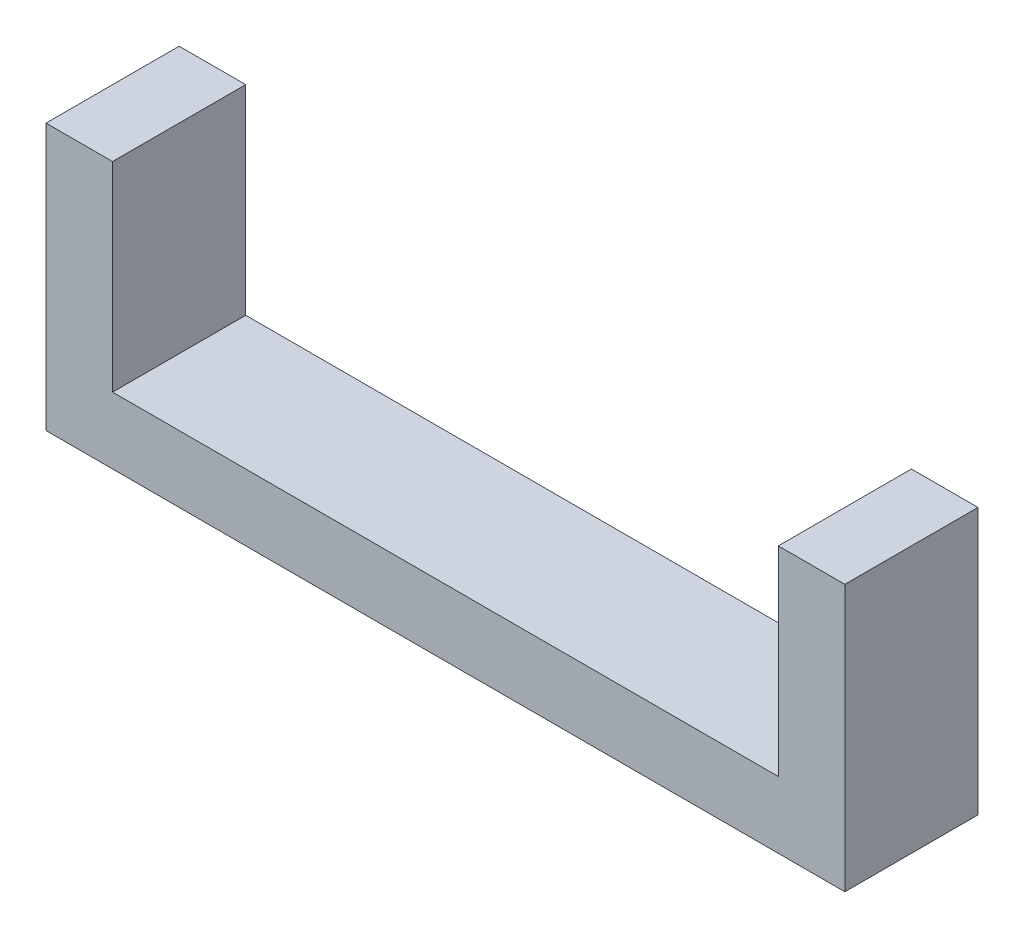
ISO-10303-21;
HEADER;
FILE_DESCRIPTION(('STEP AP214'),'2;1');
FILE_NAME('part.step','',(''),(''),'','','');
FILE_SCHEMA(('AUTOMOTIVE_DESIGN { 1 0 10303 214 1 1 1 1 }'));
ENDSEC;
DATA;
#1=APPLICATION_CONTEXT('core data for automotive mechanical design processes');
#2=APPLICATION_PROTOCOL_DEFINITION('international standard','automotive_design',2000,#1);
#3=PRODUCT_CONTEXT('',#1,'mechanical');
#4=PRODUCT('Part','Part','',(#3));
#5=PRODUCT_RELATED_PRODUCT_CATEGORY('part','',(#4));
#6=PRODUCT_DEFINITION_FORMATION('','',#4);
#7=PRODUCT_DEFINITION_CONTEXT('part definition',#1,'design');
#8=PRODUCT_DEFINITION('design','',#6,#7);
#9=PRODUCT_DEFINITION_SHAPE('','',#8);
#10=(LENGTH_UNIT() NAMED_UNIT(*) SI_UNIT(.MILLI.,.METRE.));
#11=(NAMED_UNIT(*) PLANE_ANGLE_UNIT() SI_UNIT($,.RADIAN.));
#12=(NAMED_UNIT(*) SI_UNIT($,.STERADIAN.) SOLID_ANGLE_UNIT());
#13=UNCERTAINTY_MEASURE_WITH_UNIT(LENGTH_MEASURE(1.E-05),#10,'distance_accuracy_value','');
#14=(GEOMETRIC_REPRESENTATION_CONTEXT(3) GLOBAL_UNCERTAINTY_ASSIGNED_CONTEXT((#13)) GLOBAL_UNIT_ASSIGNED_CONTEXT((#10,
#11,#12)) REPRESENTATION_CONTEXT('',''));
#15=CARTESIAN_POINT('',(0.,0.,0.));
#16=DIRECTION('',(0.,0.,1.));
#17=DIRECTION('',(1.,0.,0.));
#18=AXIS2_PLACEMENT_3D('',#15,#16,#17);
#19=CARTESIAN_POINT('',(-38.1,25.4,12.7));
#20=DIRECTION('',(1.,0.,0.));
#21=DIRECTION('',(0.,1.,0.));
#22=AXIS2_PLACEMENT_3D('',#19,#20,#21);
#23=PLANE('',#22);
#24=DIRECTION('',(0.,-1.,0.));
#25=VECTOR('',#24,1.);
#26=CARTESIAN_POINT('',(-38.1,25.4,0.));
#27=LINE('',#26,#25);
#28=CARTESIAN_POINT('',(-38.1,25.4,0.));
#29=VERTEX_POINT('',#28);
#30=CARTESIAN_POINT('',(-38.1,0.,0.));
#31=VERTEX_POINT('',#30);
#32=EDGE_CURVE('E128',#29,#31,#27,.T.);
#33=ORIENTED_EDGE('',*,*,#32,.T.);
#34=DIRECTION('',(0.,0.,-1.));
#35=VECTOR('',#34,1.);
#36=CARTESIAN_POINT('',(-38.1,0.,12.7));
#37=LINE('',#36,#35);
#38=CARTESIAN_POINT('',(-38.1,0.,12.7));
#39=VERTEX_POINT('',#38);
#40=EDGE_CURVE('E11',#39,#31,#37,.T.);
#41=ORIENTED_EDGE('',*,*,#40,.F.);
#42=DIRECTION('',(0.,-1.,0.));
#43=VECTOR('',#42,1.);
#44=CARTESIAN_POINT('',(-38.1,25.4,12.7));
#45=LINE('',#44,#43);
#46=CARTESIAN_POINT('',(-38.1,25.4,12.7));
#47=VERTEX_POINT('',#46);
#48=EDGE_CURVE('E142',#47,#39,#45,.T.);
#49=ORIENTED_EDGE('',*,*,#48,.F.);
#50=DIRECTION('',(0.,0.,-1.));
#51=VECTOR('',#50,1.);
#52=CARTESIAN_POINT('',(-38.1,25.4,12.7));
#53=LINE('',#52,#51);
#54=EDGE_CURVE('E124',#47,#29,#53,.T.);
#55=ORIENTED_EDGE('',*,*,#54,.T.);
#56=EDGE_LOOP('',(#33,#41,#49,#55));
#57=FACE_BOUND('',#56,.T.);
#58=ADVANCED_FACE('F32',(#57),#23,.F.);
#59=CARTESIAN_POINT('',(-38.1,0.,12.7));
#60=DIRECTION('',(0.,1.,0.));
#61=DIRECTION('',(-1.,0.,0.));
#62=AXIS2_PLACEMENT_3D('',#59,#60,#61);
#63=PLANE('',#62);
#64=DIRECTION('',(1.,0.,0.));
#65=VECTOR('',#64,1.);
#66=CARTESIAN_POINT('',(-38.1,0.,0.));
#67=LINE('',#66,#65);
#68=CARTESIAN_POINT('',(38.1,0.,0.));
#69=VERTEX_POINT('',#68);
#70=EDGE_CURVE('E131',#31,#69,#67,.T.);
#71=ORIENTED_EDGE('',*,*,#70,.T.);
#72=DIRECTION('',(0.,0.,-1.));
#73=VECTOR('',#72,1.);
#74=CARTESIAN_POINT('',(38.1,0.,12.7));
#75=LINE('',#74,#73);
#76=CARTESIAN_POINT('',(38.1,0.,12.7));
#77=VERTEX_POINT('',#76);
#78=EDGE_CURVE('E40',#77,#69,#75,.T.);
#79=ORIENTED_EDGE('',*,*,#78,.F.);
#80=DIRECTION('',(1.,0.,0.));
#81=VECTOR('',#80,1.);
#82=CARTESIAN_POINT('',(-38.1,0.,12.7));
#83=LINE('',#82,#81);
#84=EDGE_CURVE('E91',#39,#77,#83,.T.);
#85=ORIENTED_EDGE('',*,*,#84,.F.);
#86=ORIENTED_EDGE('',*,*,#40,.T.);
#87=EDGE_LOOP('',(#71,#79,#85,#86));
#88=FACE_BOUND('',#87,.T.);
#89=ADVANCED_FACE('F177',(#88),#63,.F.);
#90=CARTESIAN_POINT('',(38.1,0.,12.7));
#91=DIRECTION('',(-1.,0.,0.));
#92=DIRECTION('',(0.,-1.,0.));
#93=AXIS2_PLACEMENT_3D('',#90,#91,#92);
#94=PLANE('',#93);
#95=DIRECTION('',(0.,1.,0.));
#96=VECTOR('',#95,1.);
#97=CARTESIAN_POINT('',(38.1,0.,0.));
#98=LINE('',#97,#96);
#99=CARTESIAN_POINT('',(38.1,25.4,0.));
#100=VERTEX_POINT('',#99);
#101=EDGE_CURVE('E133',#69,#100,#98,.T.);
#102=ORIENTED_EDGE('',*,*,#101,.T.);
#103=DIRECTION('',(0.,0.,-1.));
#104=VECTOR('',#103,1.);
#105=CARTESIAN_POINT('',(38.1,25.4,12.7));
#106=LINE('',#105,#104);
#107=CARTESIAN_POINT('',(38.1,25.4,12.7));
#108=VERTEX_POINT('',#107);
#109=EDGE_CURVE('E149',#108,#100,#106,.T.);
#110=ORIENTED_EDGE('',*,*,#109,.F.);
#111=DIRECTION('',(0.,1.,0.));
#112=VECTOR('',#111,1.);
#113=CARTESIAN_POINT('',(38.1,0.,12.7));
#114=LINE('',#113,#112);
#115=EDGE_CURVE('E157',#77,#108,#114,.T.);
#116=ORIENTED_EDGE('',*,*,#115,.F.);
#117=ORIENTED_EDGE('',*,*,#78,.T.);
#118=EDGE_LOOP('',(#102,#110,#116,#117));
#119=FACE_BOUND('',#118,.T.);
#120=ADVANCED_FACE('F155',(#119),#94,.F.);
#121=CARTESIAN_POINT('',(38.1,25.4,12.7));
#122=DIRECTION('',(0.,-1.,0.));
#123=DIRECTION('',(0.,0.,-1.));
#124=AXIS2_PLACEMENT_3D('',#121,#122,#123);
#125=PLANE('',#124);
#126=DIRECTION('',(-1.,0.,0.));
#127=VECTOR('',#126,1.);
#128=CARTESIAN_POINT('',(38.1,25.4,0.));
#129=LINE('',#128,#127);
#130=CARTESIAN_POINT('',(31.75,25.4,0.));
#131=VERTEX_POINT('',#130);
#132=EDGE_CURVE('E135',#100,#131,#129,.T.);
#133=ORIENTED_EDGE('',*,*,#132,.T.);
#134=DIRECTION('',(0.,0.,-1.));
#135=VECTOR('',#134,1.);
#136=CARTESIAN_POINT('',(31.75,25.4,12.7));
#137=LINE('',#136,#135);
#138=CARTESIAN_POINT('',(31.75,25.4,12.7));
#139=VERTEX_POINT('',#138);
#140=EDGE_CURVE('E146',#139,#131,#137,.T.);
#141=ORIENTED_EDGE('',*,*,#140,.F.);
#142=DIRECTION('',(-1.,0.,0.));
#143=VECTOR('',#142,1.);
#144=CARTESIAN_POINT('',(38.1,25.4,12.7));
#145=LINE('',#144,#143);
#146=EDGE_CURVE('E169',#108,#139,#145,.T.);
#147=ORIENTED_EDGE('',*,*,#146,.F.);
#148=ORIENTED_EDGE('',*,*,#109,.T.);
#149=EDGE_LOOP('',(#133,#141,#147,#148));
#150=FACE_BOUND('',#149,.T.);
#151=ADVANCED_FACE('F165',(#150),#125,.F.);
#152=CARTESIAN_POINT('',(31.75,25.4,12.7));
#153=DIRECTION('',(1.,0.,0.));
#154=DIRECTION('',(0.,1.,0.));
#155=AXIS2_PLACEMENT_3D('',#152,#153,#154);
#156=PLANE('',#155);
#157=DIRECTION('',(0.,-1.,0.));
#158=VECTOR('',#157,1.);
#159=CARTESIAN_POINT('',(31.75,25.4,0.));
#160=LINE('',#159,#158);
#161=CARTESIAN_POINT('',(31.75,6.35,0.));
#162=VERTEX_POINT('',#161);
#163=EDGE_CURVE('E137',#131,#162,#160,.T.);
#164=ORIENTED_EDGE('',*,*,#163,.T.);
#165=DIRECTION('',(0.,0.,-1.));
#166=VECTOR('',#165,1.);
#167=CARTESIAN_POINT('',(31.75,6.35,12.7));
#168=LINE('',#167,#166);
#169=CARTESIAN_POINT('',(31.75,6.35,12.7));
#170=VERTEX_POINT('',#169);
#171=EDGE_CURVE('E119',#170,#162,#168,.T.);
#172=ORIENTED_EDGE('',*,*,#171,.F.);
#173=DIRECTION('',(0.,-1.,0.));
#174=VECTOR('',#173,1.);
#175=CARTESIAN_POINT('',(31.75,25.4,12.7));
#176=LINE('',#175,#174);
#177=EDGE_CURVE('E110',#139,#170,#176,.T.);
#178=ORIENTED_EDGE('',*,*,#177,.F.);
#179=ORIENTED_EDGE('',*,*,#140,.T.);
#180=EDGE_LOOP('',(#164,#172,#178,#179));
#181=FACE_BOUND('',#180,.T.);
#182=ADVANCED_FACE('F168',(#181),#156,.F.);
#183=CARTESIAN_POINT('',(31.75,6.35,12.7));
#184=DIRECTION('',(0.,-1.,0.));
#185=DIRECTION('',(1.,0.,0.));
#186=AXIS2_PLACEMENT_3D('',#183,#184,#185);
#187=PLANE('',#186);
#188=DIRECTION('',(-1.,0.,0.));
#189=VECTOR('',#188,1.);
#190=CARTESIAN_POINT('',(31.75,6.35,0.));
#191=LINE('',#190,#189);
#192=CARTESIAN_POINT('',(-31.75,6.34999999999999,0.));
#193=VERTEX_POINT('',#192);
#194=EDGE_CURVE('E118',#162,#193,#191,.T.);
#195=ORIENTED_EDGE('',*,*,#194,.T.);
#196=DIRECTION('',(0.,0.,-1.));
#197=VECTOR('',#196,1.);
#198=CARTESIAN_POINT('',(-31.75,6.34999999999999,12.7));
#199=LINE('',#198,#197);
#200=CARTESIAN_POINT('',(-31.75,6.34999999999999,12.7));
#201=VERTEX_POINT('',#200);
#202=EDGE_CURVE('E115',#201,#193,#199,.T.);
#203=ORIENTED_EDGE('',*,*,#202,.F.);
#204=DIRECTION('',(-1.,0.,0.));
#205=VECTOR('',#204,1.);
#206=CARTESIAN_POINT('',(31.75,6.35,12.7));
#207=LINE('',#206,#205);
#208=EDGE_CURVE('E104',#170,#201,#207,.T.);
#209=ORIENTED_EDGE('',*,*,#208,.F.);
#210=ORIENTED_EDGE('',*,*,#171,.T.);
#211=EDGE_LOOP('',(#195,#203,#209,#210));
#212=FACE_BOUND('',#211,.T.);
#213=ADVANCED_FACE('F116',(#212),#187,.F.);
#214=CARTESIAN_POINT('',(-31.75,6.34999999999999,12.7));
#215=DIRECTION('',(-1.,0.,0.));
#216=DIRECTION('',(0.,-1.,0.));
#217=AXIS2_PLACEMENT_3D('',#214,#215,#216);
#218=PLANE('',#217);
#219=DIRECTION('',(0.,1.,0.));
#220=VECTOR('',#219,1.);
#221=CARTESIAN_POINT('',(-31.75,6.34999999999999,0.));
#222=LINE('',#221,#220);
#223=CARTESIAN_POINT('',(-31.75,25.4,0.));
#224=VERTEX_POINT('',#223);
#225=EDGE_CURVE('E77',#193,#224,#222,.T.);
#226=ORIENTED_EDGE('',*,*,#225,.T.);
#227=DIRECTION('',(0.,0.,-1.));
#228=VECTOR('',#227,1.);
#229=CARTESIAN_POINT('',(-31.75,25.4,12.7));
#230=LINE('',#229,#228);
#231=CARTESIAN_POINT('',(-31.75,25.4,12.7));
#232=VERTEX_POINT('',#231);
#233=EDGE_CURVE('E120',#232,#224,#230,.T.);
#234=ORIENTED_EDGE('',*,*,#233,.F.);
#235=DIRECTION('',(0.,1.,0.));
#236=VECTOR('',#235,1.);
#237=CARTESIAN_POINT('',(-31.75,6.34999999999999,12.7));
#238=LINE('',#237,#236);
#239=EDGE_CURVE('E108',#201,#232,#238,.T.);
#240=ORIENTED_EDGE('',*,*,#239,.F.);
#241=ORIENTED_EDGE('',*,*,#202,.T.);
#242=EDGE_LOOP('',(#226,#234,#240,#241));
#243=FACE_BOUND('',#242,.T.);
#244=ADVANCED_FACE('F122',(#243),#218,.F.);
#245=CARTESIAN_POINT('',(-31.75,25.4,12.7));
#246=DIRECTION('',(0.,-1.,0.));
#247=DIRECTION('',(1.,0.,0.));
#248=AXIS2_PLACEMENT_3D('',#245,#246,#247);
#249=PLANE('',#248);
#250=DIRECTION('',(-1.,0.,0.));
#251=VECTOR('',#250,1.);
#252=CARTESIAN_POINT('',(-31.75,25.4,0.));
#253=LINE('',#252,#251);
#254=EDGE_CURVE('E83',#224,#29,#253,.T.);
#255=ORIENTED_EDGE('',*,*,#254,.T.);
#256=ORIENTED_EDGE('',*,*,#54,.F.);
#257=DIRECTION('',(-1.,0.,0.));
#258=VECTOR('',#257,1.);
#259=CARTESIAN_POINT('',(-31.75,25.4,12.7));
#260=LINE('',#259,#258);
#261=EDGE_CURVE('E48',#232,#47,#260,.T.);
#262=ORIENTED_EDGE('',*,*,#261,.F.);
#263=ORIENTED_EDGE('',*,*,#233,.T.);
#264=EDGE_LOOP('',(#255,#256,#262,#263));
#265=FACE_BOUND('',#264,.T.);
#266=ADVANCED_FACE('F193',(#265),#249,.F.);
#267=CARTESIAN_POINT('',(0.,0.,12.7));
#268=DIRECTION('',(0.,0.,1.));
#269=DIRECTION('',(1.,0.,0.));
#270=AXIS2_PLACEMENT_3D('',#267,#268,#269);
#271=PLANE('',#270);
#272=ORIENTED_EDGE('',*,*,#48,.T.);
#273=ORIENTED_EDGE('',*,*,#84,.T.);
#274=ORIENTED_EDGE('',*,*,#115,.T.);
#275=ORIENTED_EDGE('',*,*,#146,.T.);
#276=ORIENTED_EDGE('',*,*,#177,.T.);
#277=ORIENTED_EDGE('',*,*,#208,.T.);
#278=ORIENTED_EDGE('',*,*,#239,.T.);
#279=ORIENTED_EDGE('',*,*,#261,.T.);
#280=EDGE_LOOP('',(#272,#273,#274,#275,#276,#277,#278,#279));
#281=FACE_BOUND('',#280,.T.);
#282=ADVANCED_FACE('F106',(#281),#271,.T.);
#283=CARTESIAN_POINT('',(0.,0.,0.));
#284=DIRECTION('',(0.,0.,1.));
#285=DIRECTION('',(1.,0.,0.));
#286=AXIS2_PLACEMENT_3D('',#283,#284,#285);
#287=PLANE('',#286);
#288=ORIENTED_EDGE('',*,*,#32,.F.);
#289=ORIENTED_EDGE('',*,*,#254,.F.);
#290=ORIENTED_EDGE('',*,*,#225,.F.);
#291=ORIENTED_EDGE('',*,*,#194,.F.);
#292=ORIENTED_EDGE('',*,*,#163,.F.);
#293=ORIENTED_EDGE('',*,*,#132,.F.);
#294=ORIENTED_EDGE('',*,*,#101,.F.);
#295=ORIENTED_EDGE('',*,*,#70,.F.);
#296=EDGE_LOOP('',(#288,#289,#290,#291,#292,#293,#294,#295));
#297=FACE_BOUND('',#296,.T.);
#298=ADVANCED_FACE('F161',(#297),#287,.F.);
#299=CLOSED_SHELL('',(#58,#89,#120,#151,#182,#213,#244,#266,#282,#298));
#300=MANIFOLD_SOLID_BREP('B2',#299);
#301=ADVANCED_BREP_SHAPE_REPRESENTATION('',(#18,#300),#14);
#302=SHAPE_DEFINITION_REPRESENTATION(#9,#301);
ENDSEC;
END-ISO-10303-21;
